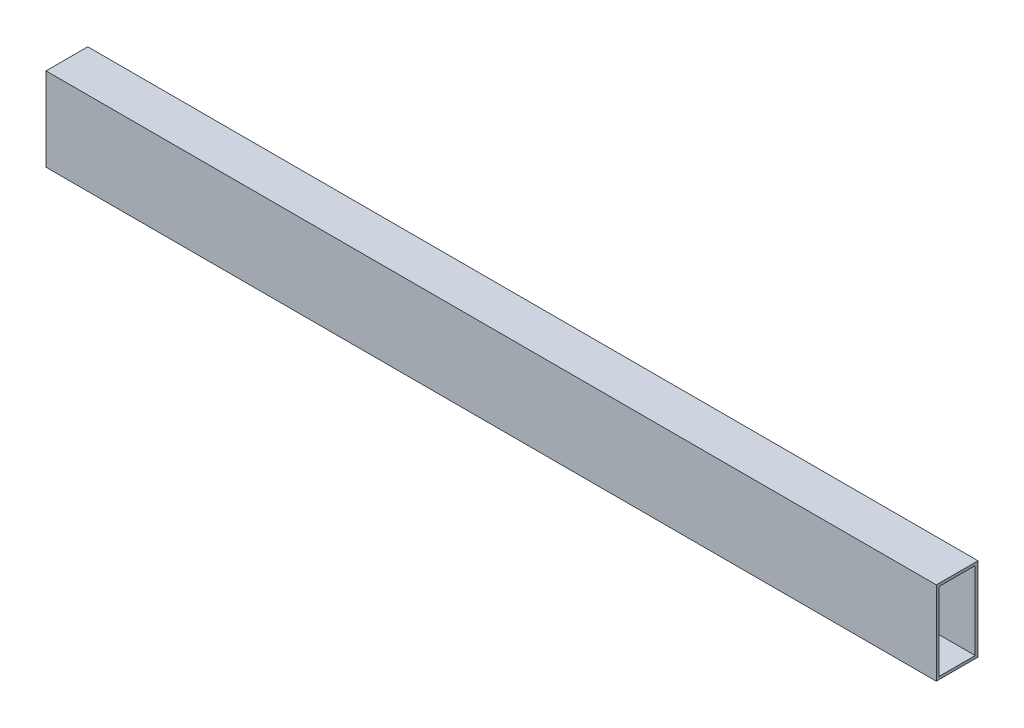
ISO-10303-21;
HEADER;
FILE_DESCRIPTION(('STEP AP214'),'2;1');
FILE_NAME('part.step','',(''),(''),'','','');
FILE_SCHEMA(('AUTOMOTIVE_DESIGN { 1 0 10303 214 1 1 1 1 }'));
ENDSEC;
DATA;
#1=APPLICATION_CONTEXT('core data for automotive mechanical design processes');
#2=APPLICATION_PROTOCOL_DEFINITION('international standard','automotive_design',2000,#1);
#3=PRODUCT_CONTEXT('',#1,'mechanical');
#4=PRODUCT('Part','Part','',(#3));
#5=PRODUCT_RELATED_PRODUCT_CATEGORY('part','',(#4));
#6=PRODUCT_DEFINITION_FORMATION('','',#4);
#7=PRODUCT_DEFINITION_CONTEXT('part definition',#1,'design');
#8=PRODUCT_DEFINITION('design','',#6,#7);
#9=PRODUCT_DEFINITION_SHAPE('','',#8);
#10=(LENGTH_UNIT() NAMED_UNIT(*) SI_UNIT(.MILLI.,.METRE.));
#11=(NAMED_UNIT(*) PLANE_ANGLE_UNIT() SI_UNIT($,.RADIAN.));
#12=(NAMED_UNIT(*) SI_UNIT($,.STERADIAN.) SOLID_ANGLE_UNIT());
#13=UNCERTAINTY_MEASURE_WITH_UNIT(LENGTH_MEASURE(1.E-05),#10,'distance_accuracy_value','');
#14=(GEOMETRIC_REPRESENTATION_CONTEXT(3) GLOBAL_UNCERTAINTY_ASSIGNED_CONTEXT((#13)) GLOBAL_UNIT_ASSIGNED_CONTEXT((#10,
#11,#12)) REPRESENTATION_CONTEXT('',''));
#15=CARTESIAN_POINT('',(0.,0.,0.));
#16=DIRECTION('',(0.,0.,1.));
#17=DIRECTION('',(1.,0.,0.));
#18=AXIS2_PLACEMENT_3D('',#15,#16,#17);
#19=CARTESIAN_POINT('',(160.,10.,1375.));
#20=DIRECTION('',(0.,0.,1.));
#21=DIRECTION('',(1.,0.,0.));
#22=AXIS2_PLACEMENT_3D('',#19,#20,#21);
#23=PLANE('',#22);
#24=DIRECTION('',(-1.,0.,0.));
#25=VECTOR('',#24,1.);
#26=CARTESIAN_POINT('',(160.,40.,1375.));
#27=LINE('',#26,#25);
#28=CARTESIAN_POINT('',(160.,40.,1375.));
#29=VERTEX_POINT('',#28);
#30=CARTESIAN_POINT('',(-160.,40.,1375.));
#31=VERTEX_POINT('',#30);
#32=EDGE_CURVE('E42',#29,#31,#27,.T.);
#33=ORIENTED_EDGE('',*,*,#32,.T.);
#34=DIRECTION('',(0.,1.,0.));
#35=VECTOR('',#34,1.);
#36=CARTESIAN_POINT('',(-160.,10.,1375.));
#37=LINE('',#36,#35);
#38=CARTESIAN_POINT('',(-160.,10.,1375.));
#39=VERTEX_POINT('',#38);
#40=EDGE_CURVE('E134',#39,#31,#37,.T.);
#41=ORIENTED_EDGE('',*,*,#40,.F.);
#42=DIRECTION('',(-1.,0.,0.));
#43=VECTOR('',#42,1.);
#44=CARTESIAN_POINT('',(160.,10.,1375.));
#45=LINE('',#44,#43);
#46=CARTESIAN_POINT('',(160.,10.,1375.));
#47=VERTEX_POINT('',#46);
#48=EDGE_CURVE('E11',#47,#39,#45,.T.);
#49=ORIENTED_EDGE('',*,*,#48,.F.);
#50=DIRECTION('',(0.,1.,0.));
#51=VECTOR('',#50,1.);
#52=CARTESIAN_POINT('',(160.,10.,1375.));
#53=LINE('',#52,#51);
#54=EDGE_CURVE('E153',#47,#29,#53,.T.);
#55=ORIENTED_EDGE('',*,*,#54,.T.);
#56=EDGE_LOOP('',(#33,#41,#49,#55));
#57=FACE_BOUND('',#56,.T.);
#58=ADVANCED_FACE('F39',(#57),#23,.T.);
#59=CARTESIAN_POINT('',(160.,10.,1360.));
#60=DIRECTION('',(0.,-1.,0.));
#61=DIRECTION('',(0.,0.,-1.));
#62=AXIS2_PLACEMENT_3D('',#59,#60,#61);
#63=PLANE('',#62);
#64=ORIENTED_EDGE('',*,*,#48,.T.);
#65=DIRECTION('',(0.,0.,1.));
#66=VECTOR('',#65,1.);
#67=CARTESIAN_POINT('',(-160.,10.,1360.));
#68=LINE('',#67,#66);
#69=CARTESIAN_POINT('',(-160.,10.,1360.));
#70=VERTEX_POINT('',#69);
#71=EDGE_CURVE('E143',#70,#39,#68,.T.);
#72=ORIENTED_EDGE('',*,*,#71,.F.);
#73=DIRECTION('',(-1.,0.,0.));
#74=VECTOR('',#73,1.);
#75=CARTESIAN_POINT('',(160.,10.,1360.));
#76=LINE('',#75,#74);
#77=CARTESIAN_POINT('',(160.,10.,1360.));
#78=VERTEX_POINT('',#77);
#79=EDGE_CURVE('E47',#78,#70,#76,.T.);
#80=ORIENTED_EDGE('',*,*,#79,.F.);
#81=DIRECTION('',(0.,0.,1.));
#82=VECTOR('',#81,1.);
#83=CARTESIAN_POINT('',(160.,10.,1360.));
#84=LINE('',#83,#82);
#85=EDGE_CURVE('E164',#78,#47,#84,.T.);
#86=ORIENTED_EDGE('',*,*,#85,.T.);
#87=EDGE_LOOP('',(#64,#72,#80,#86));
#88=FACE_BOUND('',#87,.T.);
#89=ADVANCED_FACE('F176',(#88),#63,.T.);
#90=CARTESIAN_POINT('',(160.,10.,1360.));
#91=DIRECTION('',(0.,0.,-1.));
#92=DIRECTION('',(-1.,0.,0.));
#93=AXIS2_PLACEMENT_3D('',#90,#91,#92);
#94=PLANE('',#93);
#95=ORIENTED_EDGE('',*,*,#79,.T.);
#96=DIRECTION('',(0.,-1.,0.));
#97=VECTOR('',#96,1.);
#98=CARTESIAN_POINT('',(-160.,10.,1360.));
#99=LINE('',#98,#97);
#100=CARTESIAN_POINT('',(-160.,40.,1360.));
#101=VERTEX_POINT('',#100);
#102=EDGE_CURVE('E140',#101,#70,#99,.T.);
#103=ORIENTED_EDGE('',*,*,#102,.F.);
#104=DIRECTION('',(-1.,0.,0.));
#105=VECTOR('',#104,1.);
#106=CARTESIAN_POINT('',(160.,40.,1360.));
#107=LINE('',#106,#105);
#108=CARTESIAN_POINT('',(160.,40.,1360.));
#109=VERTEX_POINT('',#108);
#110=EDGE_CURVE('E167',#109,#101,#107,.T.);
#111=ORIENTED_EDGE('',*,*,#110,.F.);
#112=DIRECTION('',(0.,-1.,0.));
#113=VECTOR('',#112,1.);
#114=CARTESIAN_POINT('',(160.,10.,1360.));
#115=LINE('',#114,#113);
#116=EDGE_CURVE('E161',#109,#78,#115,.T.);
#117=ORIENTED_EDGE('',*,*,#116,.T.);
#118=EDGE_LOOP('',(#95,#103,#111,#117));
#119=FACE_BOUND('',#118,.T.);
#120=ADVANCED_FACE('F182',(#119),#94,.T.);
#121=CARTESIAN_POINT('',(160.,40.,1360.));
#122=DIRECTION('',(0.,1.,0.));
#123=DIRECTION('',(0.,0.,1.));
#124=AXIS2_PLACEMENT_3D('',#121,#122,#123);
#125=PLANE('',#124);
#126=ORIENTED_EDGE('',*,*,#110,.T.);
#127=DIRECTION('',(0.,0.,-1.));
#128=VECTOR('',#127,1.);
#129=CARTESIAN_POINT('',(-160.,40.,1360.));
#130=LINE('',#129,#128);
#131=EDGE_CURVE('E137',#31,#101,#130,.T.);
#132=ORIENTED_EDGE('',*,*,#131,.F.);
#133=ORIENTED_EDGE('',*,*,#32,.F.);
#134=DIRECTION('',(0.,0.,-1.));
#135=VECTOR('',#134,1.);
#136=CARTESIAN_POINT('',(160.,40.,1360.));
#137=LINE('',#136,#135);
#138=EDGE_CURVE('E158',#29,#109,#137,.T.);
#139=ORIENTED_EDGE('',*,*,#138,.T.);
#140=EDGE_LOOP('',(#126,#132,#133,#139));
#141=FACE_BOUND('',#140,.T.);
#142=ADVANCED_FACE('F171',(#141),#125,.T.);
#143=CARTESIAN_POINT('',(160.,0.,0.));
#144=DIRECTION('',(1.,0.,0.));
#145=DIRECTION('',(0.,0.,-1.));
#146=AXIS2_PLACEMENT_3D('',#143,#144,#145);
#147=PLANE('',#146);
#148=DIRECTION('',(0.,0.,1.));
#149=VECTOR('',#148,1.);
#150=CARTESIAN_POINT('',(160.,11.,1361.));
#151=LINE('',#150,#149);
#152=CARTESIAN_POINT('',(160.,11.,1361.));
#153=VERTEX_POINT('',#152);
#154=CARTESIAN_POINT('',(160.,11.,1374.));
#155=VERTEX_POINT('',#154);
#156=EDGE_CURVE('E146',#153,#155,#151,.T.);
#157=ORIENTED_EDGE('',*,*,#156,.T.);
#158=DIRECTION('',(0.,1.,0.));
#159=VECTOR('',#158,1.);
#160=CARTESIAN_POINT('',(160.,11.,1374.));
#161=LINE('',#160,#159);
#162=CARTESIAN_POINT('',(160.,39.,1374.));
#163=VERTEX_POINT('',#162);
#164=EDGE_CURVE('E111',#155,#163,#161,.T.);
#165=ORIENTED_EDGE('',*,*,#164,.T.);
#166=DIRECTION('',(0.,0.,-1.));
#167=VECTOR('',#166,1.);
#168=CARTESIAN_POINT('',(160.,39.,1361.));
#169=LINE('',#168,#167);
#170=CARTESIAN_POINT('',(160.,39.,1361.));
#171=VERTEX_POINT('',#170);
#172=EDGE_CURVE('E55',#163,#171,#169,.T.);
#173=ORIENTED_EDGE('',*,*,#172,.T.);
#174=DIRECTION('',(0.,-1.,0.));
#175=VECTOR('',#174,1.);
#176=CARTESIAN_POINT('',(160.,11.,1361.));
#177=LINE('',#176,#175);
#178=EDGE_CURVE('E116',#171,#153,#177,.T.);
#179=ORIENTED_EDGE('',*,*,#178,.T.);
#180=EDGE_LOOP('',(#157,#165,#173,#179));
#181=FACE_BOUND('',#180,.T.);
#182=ORIENTED_EDGE('',*,*,#54,.F.);
#183=ORIENTED_EDGE('',*,*,#85,.F.);
#184=ORIENTED_EDGE('',*,*,#116,.F.);
#185=ORIENTED_EDGE('',*,*,#138,.F.);
#186=EDGE_LOOP('',(#182,#183,#184,#185));
#187=FACE_BOUND('',#186,.T.);
#188=ADVANCED_FACE('F180',(#181,#187),#147,.T.);
#189=CARTESIAN_POINT('',(160.,11.,1361.));
#190=DIRECTION('',(0.,-1.,0.));
#191=DIRECTION('',(0.,0.,-1.));
#192=AXIS2_PLACEMENT_3D('',#189,#190,#191);
#193=PLANE('',#192);
#194=DIRECTION('',(-1.,0.,0.));
#195=VECTOR('',#194,1.);
#196=CARTESIAN_POINT('',(160.,11.,1361.));
#197=LINE('',#196,#195);
#198=CARTESIAN_POINT('',(-160.,11.,1361.));
#199=VERTEX_POINT('',#198);
#200=EDGE_CURVE('E121',#153,#199,#197,.T.);
#201=ORIENTED_EDGE('',*,*,#200,.T.);
#202=DIRECTION('',(0.,0.,1.));
#203=VECTOR('',#202,1.);
#204=CARTESIAN_POINT('',(-160.,11.,1361.));
#205=LINE('',#204,#203);
#206=CARTESIAN_POINT('',(-160.,11.,1374.));
#207=VERTEX_POINT('',#206);
#208=EDGE_CURVE('E119',#199,#207,#205,.T.);
#209=ORIENTED_EDGE('',*,*,#208,.T.);
#210=DIRECTION('',(-1.,0.,0.));
#211=VECTOR('',#210,1.);
#212=CARTESIAN_POINT('',(160.,11.,1374.));
#213=LINE('',#212,#211);
#214=EDGE_CURVE('E104',#155,#207,#213,.T.);
#215=ORIENTED_EDGE('',*,*,#214,.F.);
#216=ORIENTED_EDGE('',*,*,#156,.F.);
#217=EDGE_LOOP('',(#201,#209,#215,#216));
#218=FACE_BOUND('',#217,.T.);
#219=ADVANCED_FACE('F120',(#218),#193,.F.);
#220=CARTESIAN_POINT('',(160.,11.,1361.));
#221=DIRECTION('',(0.,0.,-1.));
#222=DIRECTION('',(-1.,0.,0.));
#223=AXIS2_PLACEMENT_3D('',#220,#221,#222);
#224=PLANE('',#223);
#225=DIRECTION('',(-1.,0.,0.));
#226=VECTOR('',#225,1.);
#227=CARTESIAN_POINT('',(160.,39.,1361.));
#228=LINE('',#227,#226);
#229=CARTESIAN_POINT('',(-160.,39.,1361.));
#230=VERTEX_POINT('',#229);
#231=EDGE_CURVE('E154',#171,#230,#228,.T.);
#232=ORIENTED_EDGE('',*,*,#231,.T.);
#233=DIRECTION('',(0.,-1.,0.));
#234=VECTOR('',#233,1.);
#235=CARTESIAN_POINT('',(-160.,11.,1361.));
#236=LINE('',#235,#234);
#237=EDGE_CURVE('E130',#230,#199,#236,.T.);
#238=ORIENTED_EDGE('',*,*,#237,.T.);
#239=ORIENTED_EDGE('',*,*,#200,.F.);
#240=ORIENTED_EDGE('',*,*,#178,.F.);
#241=EDGE_LOOP('',(#232,#238,#239,#240));
#242=FACE_BOUND('',#241,.T.);
#243=ADVANCED_FACE('F225',(#242),#224,.F.);
#244=CARTESIAN_POINT('',(160.,39.,1361.));
#245=DIRECTION('',(0.,1.,0.));
#246=DIRECTION('',(0.,0.,1.));
#247=AXIS2_PLACEMENT_3D('',#244,#245,#246);
#248=PLANE('',#247);
#249=DIRECTION('',(-1.,0.,0.));
#250=VECTOR('',#249,1.);
#251=CARTESIAN_POINT('',(160.,39.,1374.));
#252=LINE('',#251,#250);
#253=CARTESIAN_POINT('',(-160.,39.,1374.));
#254=VERTEX_POINT('',#253);
#255=EDGE_CURVE('E115',#163,#254,#252,.T.);
#256=ORIENTED_EDGE('',*,*,#255,.T.);
#257=DIRECTION('',(0.,0.,-1.));
#258=VECTOR('',#257,1.);
#259=CARTESIAN_POINT('',(-160.,39.,1361.));
#260=LINE('',#259,#258);
#261=EDGE_CURVE('E128',#254,#230,#260,.T.);
#262=ORIENTED_EDGE('',*,*,#261,.T.);
#263=ORIENTED_EDGE('',*,*,#231,.F.);
#264=ORIENTED_EDGE('',*,*,#172,.F.);
#265=EDGE_LOOP('',(#256,#262,#263,#264));
#266=FACE_BOUND('',#265,.T.);
#267=ADVANCED_FACE('F233',(#266),#248,.F.);
#268=CARTESIAN_POINT('',(160.,11.,1374.));
#269=DIRECTION('',(0.,0.,1.));
#270=DIRECTION('',(1.,0.,0.));
#271=AXIS2_PLACEMENT_3D('',#268,#269,#270);
#272=PLANE('',#271);
#273=ORIENTED_EDGE('',*,*,#214,.T.);
#274=DIRECTION('',(0.,1.,0.));
#275=VECTOR('',#274,1.);
#276=CARTESIAN_POINT('',(-160.,11.,1374.));
#277=LINE('',#276,#275);
#278=EDGE_CURVE('E108',#207,#254,#277,.T.);
#279=ORIENTED_EDGE('',*,*,#278,.T.);
#280=ORIENTED_EDGE('',*,*,#255,.F.);
#281=ORIENTED_EDGE('',*,*,#164,.F.);
#282=EDGE_LOOP('',(#273,#279,#280,#281));
#283=FACE_BOUND('',#282,.T.);
#284=ADVANCED_FACE('F106',(#283),#272,.F.);
#285=CARTESIAN_POINT('',(-160.,0.,0.));
#286=DIRECTION('',(1.,0.,0.));
#287=DIRECTION('',(0.,0.,-1.));
#288=AXIS2_PLACEMENT_3D('',#285,#286,#287);
#289=PLANE('',#288);
#290=ORIENTED_EDGE('',*,*,#40,.T.);
#291=ORIENTED_EDGE('',*,*,#131,.T.);
#292=ORIENTED_EDGE('',*,*,#102,.T.);
#293=ORIENTED_EDGE('',*,*,#71,.T.);
#294=EDGE_LOOP('',(#290,#291,#292,#293));
#295=FACE_BOUND('',#294,.T.);
#296=ORIENTED_EDGE('',*,*,#208,.F.);
#297=ORIENTED_EDGE('',*,*,#237,.F.);
#298=ORIENTED_EDGE('',*,*,#261,.F.);
#299=ORIENTED_EDGE('',*,*,#278,.F.);
#300=EDGE_LOOP('',(#296,#297,#298,#299));
#301=FACE_BOUND('',#300,.T.);
#302=ADVANCED_FACE('F126',(#295,#301),#289,.F.);
#303=CLOSED_SHELL('',(#58,#89,#120,#142,#188,#219,#243,#267,#284,#302));
#304=MANIFOLD_SOLID_BREP('B2',#303);
#305=ADVANCED_BREP_SHAPE_REPRESENTATION('',(#18,#304),#14);
#306=SHAPE_DEFINITION_REPRESENTATION(#9,#305);
ENDSEC;
END-ISO-10303-21;
